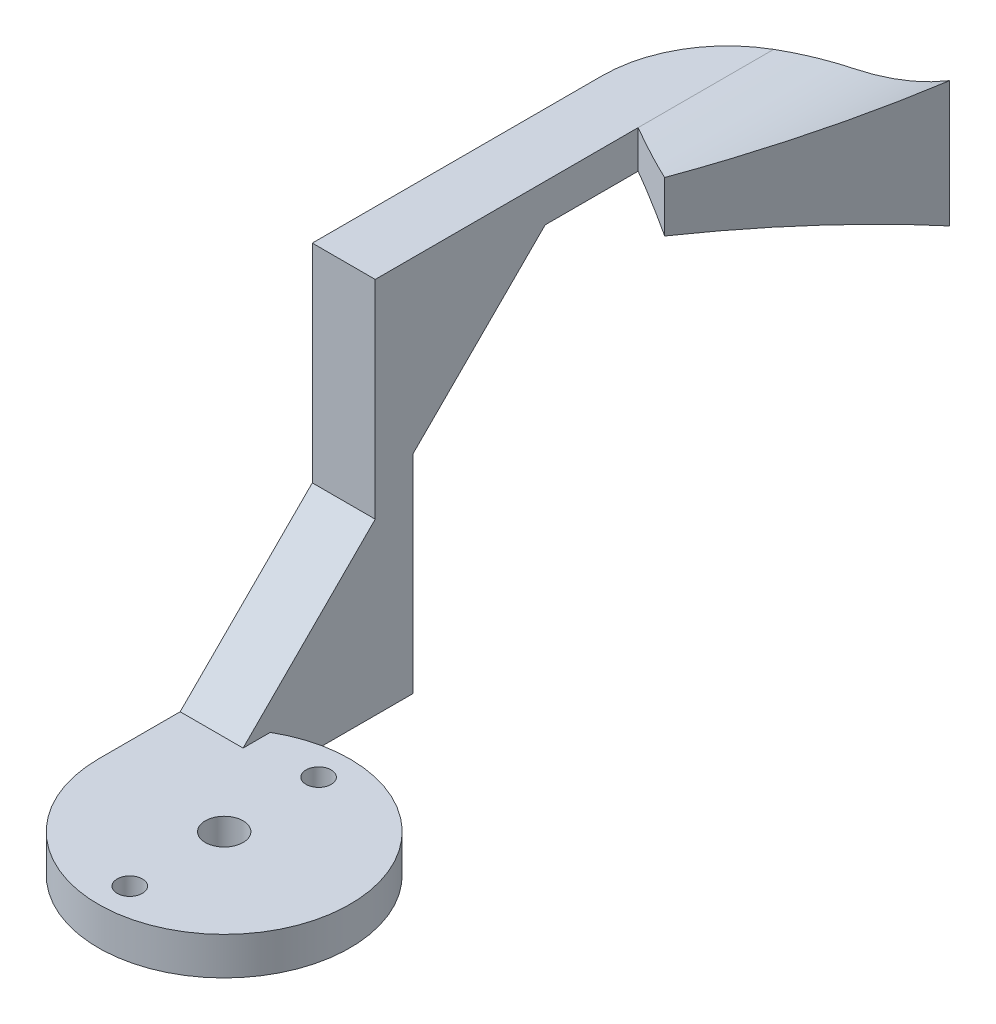
ISO-10303-21;
HEADER;
FILE_DESCRIPTION(('STEP AP214'),'2;1');
FILE_NAME('part.step','',(''),(''),'','','');
FILE_SCHEMA(('AUTOMOTIVE_DESIGN { 1 0 10303 214 1 1 1 1 }'));
ENDSEC;
DATA;
#1=APPLICATION_CONTEXT('core data for automotive mechanical design processes');
#2=APPLICATION_PROTOCOL_DEFINITION('international standard','automotive_design',2000,#1);
#3=PRODUCT_CONTEXT('',#1,'mechanical');
#4=PRODUCT('Part','Part','',(#3));
#5=PRODUCT_RELATED_PRODUCT_CATEGORY('part','',(#4));
#6=PRODUCT_DEFINITION_FORMATION('','',#4);
#7=PRODUCT_DEFINITION_CONTEXT('part definition',#1,'design');
#8=PRODUCT_DEFINITION('design','',#6,#7);
#9=PRODUCT_DEFINITION_SHAPE('','',#8);
#10=(LENGTH_UNIT() NAMED_UNIT(*) SI_UNIT(.MILLI.,.METRE.));
#11=(NAMED_UNIT(*) PLANE_ANGLE_UNIT() SI_UNIT($,.RADIAN.));
#12=(NAMED_UNIT(*) SI_UNIT($,.STERADIAN.) SOLID_ANGLE_UNIT());
#13=UNCERTAINTY_MEASURE_WITH_UNIT(LENGTH_MEASURE(1.E-05),#10,'distance_accuracy_value','');
#14=(GEOMETRIC_REPRESENTATION_CONTEXT(3) GLOBAL_UNCERTAINTY_ASSIGNED_CONTEXT((#13)) GLOBAL_UNIT_ASSIGNED_CONTEXT((#10,
#11,#12)) REPRESENTATION_CONTEXT('',''));
#15=CARTESIAN_POINT('',(0.,0.,0.));
#16=DIRECTION('',(0.,0.,1.));
#17=DIRECTION('',(1.,0.,0.));
#18=AXIS2_PLACEMENT_3D('',#15,#16,#17);
#19=CARTESIAN_POINT('',(-10.,3.,0.));
#20=DIRECTION('',(1.,0.,0.));
#21=DIRECTION('',(0.,0.,-1.));
#22=AXIS2_PLACEMENT_3D('',#19,#20,#21);
#23=PLANE('',#22);
#24=DIRECTION('',(0.,0.,-1.));
#25=VECTOR('',#24,1.);
#26=CARTESIAN_POINT('',(-10.,30.,0.));
#27=LINE('',#26,#25);
#28=CARTESIAN_POINT('',(-10.,30.,-17.));
#29=VERTEX_POINT('',#28);
#30=CARTESIAN_POINT('',(-10.,30.,-40.));
#31=VERTEX_POINT('',#30);
#32=EDGE_CURVE('E247',#29,#31,#27,.T.);
#33=ORIENTED_EDGE('',*,*,#32,.T.);
#34=DIRECTION('',(0.,1.,0.));
#35=VECTOR('',#34,1.);
#36=CARTESIAN_POINT('',(-10.,-7.48187929913333,-40.));
#37=LINE('',#36,#35);
#38=CARTESIAN_POINT('',(-10.,27.,-40.));
#39=VERTEX_POINT('',#38);
#40=EDGE_CURVE('E226',#39,#31,#37,.T.);
#41=ORIENTED_EDGE('',*,*,#40,.F.);
#42=DIRECTION('',(0.,0.,1.));
#43=VECTOR('',#42,1.);
#44=CARTESIAN_POINT('',(-10.,27.,-17.));
#45=LINE('',#44,#43);
#46=CARTESIAN_POINT('',(-10.,27.,-30.5000000000003));
#47=VERTEX_POINT('',#46);
#48=EDGE_CURVE('E223',#39,#47,#45,.T.);
#49=ORIENTED_EDGE('',*,*,#48,.T.);
#50=DIRECTION('',(0.,-0.707106781186539,0.707106781186556));
#51=VECTOR('',#50,1.);
#52=CARTESIAN_POINT('',(-10.,-1.74999999999981,-1.74999999999977));
#53=LINE('',#52,#51);
#54=CARTESIAN_POINT('',(-10.,16.5,-20.));
#55=VERTEX_POINT('',#54);
#56=EDGE_CURVE('E237',#47,#55,#53,.T.);
#57=ORIENTED_EDGE('',*,*,#56,.T.);
#58=DIRECTION('',(0.,-1.,0.));
#59=VECTOR('',#58,1.);
#60=CARTESIAN_POINT('',(-10.,3.,-20.));
#61=LINE('',#60,#59);
#62=CARTESIAN_POINT('',(-10.,0.,-20.));
#63=VERTEX_POINT('',#62);
#64=EDGE_CURVE('E83',#55,#63,#61,.T.);
#65=ORIENTED_EDGE('',*,*,#64,.T.);
#66=DIRECTION('',(0.,0.,1.));
#67=VECTOR('',#66,1.);
#68=CARTESIAN_POINT('',(-10.,0.,0.));
#69=LINE('',#68,#67);
#70=CARTESIAN_POINT('',(-10.,0.,0.));
#71=VERTEX_POINT('',#70);
#72=EDGE_CURVE('E76',#63,#71,#69,.T.);
#73=ORIENTED_EDGE('',*,*,#72,.T.);
#74=DIRECTION('',(0.,-1.,0.));
#75=VECTOR('',#74,1.);
#76=CARTESIAN_POINT('',(-10.,3.,0.));
#77=LINE('',#76,#75);
#78=CARTESIAN_POINT('',(-10.,3.,0.));
#79=VERTEX_POINT('',#78);
#80=EDGE_CURVE('E79',#79,#71,#77,.T.);
#81=ORIENTED_EDGE('',*,*,#80,.F.);
#82=DIRECTION('',(0.,0.,1.));
#83=VECTOR('',#82,1.);
#84=CARTESIAN_POINT('',(-10.,3.,0.));
#85=LINE('',#84,#83);
#86=CARTESIAN_POINT('',(-10.,3.,-6.4999999999997));
#87=VERTEX_POINT('',#86);
#88=EDGE_CURVE('E57',#87,#79,#85,.T.);
#89=ORIENTED_EDGE('',*,*,#88,.F.);
#90=DIRECTION('',(0.,-0.707106781186539,0.707106781186556));
#91=VECTOR('',#90,1.);
#92=CARTESIAN_POINT('',(-10.,-1.74999999999981,-1.74999999999977));
#93=LINE('',#92,#91);
#94=CARTESIAN_POINT('',(-10.,13.5,-17.));
#95=VERTEX_POINT('',#94);
#96=EDGE_CURVE('E225',#95,#87,#93,.T.);
#97=ORIENTED_EDGE('',*,*,#96,.F.);
#98=DIRECTION('',(0.,1.,0.));
#99=VECTOR('',#98,1.);
#100=CARTESIAN_POINT('',(-10.,0.,-17.));
#101=LINE('',#100,#99);
#102=EDGE_CURVE('E245',#95,#29,#101,.T.);
#103=ORIENTED_EDGE('',*,*,#102,.T.);
#104=EDGE_LOOP('',(#33,#41,#49,#57,#65,#73,#81,#89,#97,#103));
#105=FACE_BOUND('',#104,.T.);
#106=ADVANCED_FACE('F36',(#105),#23,.F.);
#107=CARTESIAN_POINT('',(0.,-7.48187929913333,-40.));
#108=DIRECTION('',(0.,1.,0.));
#109=DIRECTION('',(0.,0.,1.));
#110=AXIS2_PLACEMENT_3D('',#107,#108,#109);
#111=CYLINDRICAL_SURFACE('',#110,9.99999999999999);
#112=ORIENTED_EDGE('',*,*,#40,.T.);
#113=CARTESIAN_POINT('',(0.,30.,-40.));
#114=DIRECTION('',(0.,1.,0.));
#115=DIRECTION('',(0.,0.,1.));
#116=AXIS2_PLACEMENT_3D('',#113,#114,#115);
#117=CIRCLE('',#116,9.99999999999999);
#118=CARTESIAN_POINT('',(-5.,30.,-48.6602540378444));
#119=VERTEX_POINT('',#118);
#120=EDGE_CURVE('E214',#31,#119,#117,.F.);
#121=ORIENTED_EDGE('',*,*,#120,.T.);
#122=CARTESIAN_POINT('',(-5.00000000000001,30.,-48.6602540378444));
#123=CARTESIAN_POINT('',(-4.76780427374726,29.9999714006775,-48.794355888389));
#124=CARTESIAN_POINT('',(-4.53016700286463,30.0032883352668,-48.9190604891211));
#125=CARTESIAN_POINT('',(-4.04576558179695,30.0173383024292,-49.1489604372385));
#126=CARTESIAN_POINT('',(-3.79899883583263,30.0280734598002,-49.254150184041));
#127=CARTESIAN_POINT('',(-3.30402666138643,30.0573429613309,-49.4420276477239));
#128=CARTESIAN_POINT('',(-3.05598680798396,30.075690987092,-49.5251799428243));
#129=CARTESIAN_POINT('',(-2.55497067220456,30.120592381275,-49.6716207318108));
#130=CARTESIAN_POINT('',(-2.30199620764166,30.1471427796532,-49.7349163990032));
#131=CARTESIAN_POINT('',(-1.71146035006233,30.2185925493862,-49.8584240534306));
#132=CARTESIAN_POINT('',(-1.37267522194911,30.2666437505436,-49.9112019486332));
#133=CARTESIAN_POINT('',(-0.86114244887352,30.3502638489005,-49.9643626537235));
#134=CARTESIAN_POINT('',(-0.688716605837889,30.3803416252546,-49.9777482297035));
#135=CARTESIAN_POINT('',(-0.344078285002525,30.4442662976743,-49.9955673365444));
#136=CARTESIAN_POINT('',(-0.171865836093102,30.4781136574417,-49.9999997647795));
#137=CARTESIAN_POINT('',(0.,30.5138169810337,-50.));
#138=B_SPLINE_CURVE_WITH_KNOTS('',3,(#122,#123,#124,#125,#126,#127,#128,#129,#130,#131,#132,
#133,#134,#135,#136,#137),.UNSPECIFIED.,.F.,.F.,(4,2,2,2,2,2,2,4),(0.,0.804195556242593,
1.60862155334646,2.39442372995741,3.17994170382442,4.2162091508575,4.74260477274714,
5.26906521899087),.UNSPECIFIED.);
#139=CARTESIAN_POINT('',(0.,30.5138169810337,-50.));
#140=VERTEX_POINT('',#139);
#141=EDGE_CURVE('E281',#119,#140,#138,.T.);
#142=ORIENTED_EDGE('',*,*,#141,.T.);
#143=DIRECTION('',(0.,1.,0.));
#144=VECTOR('',#143,1.);
#145=CARTESIAN_POINT('',(0.,-7.48187929913333,-50.));
#146=LINE('',#145,#144);
#147=CARTESIAN_POINT('',(0.,26.4861830189663,-50.));
#148=VERTEX_POINT('',#147);
#149=EDGE_CURVE('E229',#148,#140,#146,.T.);
#150=ORIENTED_EDGE('',*,*,#149,.F.);
#151=CARTESIAN_POINT('',(0.,26.4861830189663,-50.));
#152=CARTESIAN_POINT('',(-0.262517746514177,26.5407557705343,-50.0000415045389));
#153=CARTESIAN_POINT('',(-0.525969076046815,26.5909590292765,-49.9896640405455));
#154=CARTESIAN_POINT('',(-1.05281929866364,26.6825239117529,-49.9479242579216));
#155=CARTESIAN_POINT('',(-1.31621815667785,26.7238830677488,-49.9165560923865));
#156=CARTESIAN_POINT('',(-1.83482498523233,26.7967733666416,-49.8336581317333));
#157=CARTESIAN_POINT('',(-2.09008145645234,26.828509777686,-49.7826116569452));
#158=CARTESIAN_POINT('',(-2.59661387865083,26.8835654184981,-49.6605076110851));
#159=CARTESIAN_POINT('',(-2.84789122021869,26.9068876537427,-49.589457201437));
#160=CARTESIAN_POINT('',(-3.2601009370102,26.9389065580437,-49.4552349147342));
#161=CARTESIAN_POINT('',(-3.42268848799357,26.9498796471891,-49.3976050194521));
#162=CARTESIAN_POINT('',(-3.74485929821452,26.9684692340454,-49.2739310376327));
#163=CARTESIAN_POINT('',(-3.90444220347491,26.9760853386094,-49.2078859667352));
#164=CARTESIAN_POINT('',(-4.22253489501878,26.988226899739,-49.0664744965941));
#165=CARTESIAN_POINT('',(-4.38098897206747,26.9927022159217,-48.99097859854));
#166=CARTESIAN_POINT('',(-4.6937345730493,26.9985910016761,-48.8317426463199));
#167=CARTESIAN_POINT('',(-4.84802658554491,27.0000048321772,-48.7480035651893));
#168=CARTESIAN_POINT('',(-5.00000000000001,27.,-48.6602540378444));
#169=B_SPLINE_CURVE_WITH_KNOTS('',3,(#151,#152,#153,#154,#155,#156,#157,#158,#159,#160,#161,
#162,#163,#164,#165,#166,#167,#168),.UNSPECIFIED.,.F.,.F.,(4,2,2,2,2,2,2,2,4),(0.,
0.804192014353111,1.60860812757328,2.3944106535297,3.1799322185136,3.69823554748103,
4.21659956042801,4.74306139262274,5.26946115496264),.UNSPECIFIED.);
#170=CARTESIAN_POINT('',(-5.,27.,-48.6602540378444));
#171=VERTEX_POINT('',#170);
#172=EDGE_CURVE('E192',#148,#171,#169,.T.);
#173=ORIENTED_EDGE('',*,*,#172,.T.);
#174=CARTESIAN_POINT('',(0.,27.,-40.));
#175=DIRECTION('',(0.,-1.,0.));
#176=DIRECTION('',(0.,0.,-1.));
#177=AXIS2_PLACEMENT_3D('',#174,#175,#176);
#178=CIRCLE('',#177,9.99999999999999);
#179=EDGE_CURVE('E219',#171,#39,#178,.F.);
#180=ORIENTED_EDGE('',*,*,#179,.T.);
#181=EDGE_LOOP('',(#112,#121,#142,#150,#173,#180));
#182=FACE_BOUND('',#181,.T.);
#183=ADVANCED_FACE('F277',(#182),#111,.T.);
#184=CARTESIAN_POINT('',(-5.,30.,0.));
#185=DIRECTION('',(0.,1.,0.));
#186=DIRECTION('',(0.,0.,1.));
#187=AXIS2_PLACEMENT_3D('',#184,#185,#186);
#188=PLANE('',#187);
#189=DIRECTION('',(0.,0.,-1.));
#190=VECTOR('',#189,1.);
#191=CARTESIAN_POINT('',(-5.,30.,0.));
#192=LINE('',#191,#190);
#193=CARTESIAN_POINT('',(-5.,30.,-17.));
#194=VERTEX_POINT('',#193);
#195=CARTESIAN_POINT('',(-5.,30.,-37.8867513459482));
#196=VERTEX_POINT('',#195);
#197=EDGE_CURVE('E239',#194,#196,#192,.T.);
#198=ORIENTED_EDGE('',*,*,#197,.T.);
#199=DIRECTION('',(0.,0.,1.));
#200=VECTOR('',#199,1.);
#201=CARTESIAN_POINT('',(-5.,30.,-50.));
#202=LINE('',#201,#200);
#203=EDGE_CURVE('E209',#119,#196,#202,.T.);
#204=ORIENTED_EDGE('',*,*,#203,.F.);
#205=ORIENTED_EDGE('',*,*,#120,.F.);
#206=ORIENTED_EDGE('',*,*,#32,.F.);
#207=DIRECTION('',(-1.,0.,0.));
#208=VECTOR('',#207,1.);
#209=CARTESIAN_POINT('',(-5.,30.,-17.));
#210=LINE('',#209,#208);
#211=EDGE_CURVE('E254',#194,#29,#210,.T.);
#212=ORIENTED_EDGE('',*,*,#211,.F.);
#213=EDGE_LOOP('',(#198,#204,#205,#206,#212));
#214=FACE_BOUND('',#213,.T.);
#215=ADVANCED_FACE('F272',(#214),#188,.T.);
#216=CARTESIAN_POINT('',(-5.,27.,0.));
#217=DIRECTION('',(0.,-1.,0.));
#218=DIRECTION('',(0.,0.,-1.));
#219=AXIS2_PLACEMENT_3D('',#216,#217,#218);
#220=PLANE('',#219);
#221=DIRECTION('',(-1.,0.,0.));
#222=VECTOR('',#221,1.);
#223=CARTESIAN_POINT('',(-5.,27.,-30.5000000000003));
#224=LINE('',#223,#222);
#225=CARTESIAN_POINT('',(-5.,27.,-30.5000000000003));
#226=VERTEX_POINT('',#225);
#227=EDGE_CURVE('E251',#226,#47,#224,.T.);
#228=ORIENTED_EDGE('',*,*,#227,.T.);
#229=ORIENTED_EDGE('',*,*,#48,.F.);
#230=ORIENTED_EDGE('',*,*,#179,.F.);
#231=DIRECTION('',(0.,0.,1.));
#232=VECTOR('',#231,1.);
#233=CARTESIAN_POINT('',(-5.,27.,-50.));
#234=LINE('',#233,#232);
#235=CARTESIAN_POINT('',(-5.,27.,-37.8867513459482));
#236=VERTEX_POINT('',#235);
#237=EDGE_CURVE('E319',#171,#236,#234,.T.);
#238=ORIENTED_EDGE('',*,*,#237,.T.);
#239=DIRECTION('',(0.,0.,-1.));
#240=VECTOR('',#239,1.);
#241=CARTESIAN_POINT('',(-5.,27.,-37.8867513459482));
#242=LINE('',#241,#240);
#243=EDGE_CURVE('E213',#226,#236,#242,.T.);
#244=ORIENTED_EDGE('',*,*,#243,.F.);
#245=EDGE_LOOP('',(#228,#229,#230,#238,#244));
#246=FACE_BOUND('',#245,.T.);
#247=ADVANCED_FACE('F320',(#246),#220,.T.);
#248=CARTESIAN_POINT('',(0.,3.,0.));
#249=DIRECTION('',(0.,1.,0.));
#250=DIRECTION('',(0.,0.,1.));
#251=AXIS2_PLACEMENT_3D('',#248,#249,#250);
#252=PLANE('',#251);
#253=CARTESIAN_POINT('',(0.,3.,-7.5));
#254=DIRECTION('',(0.,1.,0.));
#255=DIRECTION('',(0.,0.,1.));
#256=AXIS2_PLACEMENT_3D('',#253,#254,#255);
#257=CIRCLE('',#256,1.);
#258=CARTESIAN_POINT('',(0.,3.,-6.5));
#259=VERTEX_POINT('',#258);
#260=EDGE_CURVE('E198',#259,#259,#257,.T.);
#261=ORIENTED_EDGE('',*,*,#260,.F.);
#262=EDGE_LOOP('',(#261));
#263=FACE_BOUND('',#262,.T.);
#264=CARTESIAN_POINT('',(0.,3.,7.5));
#265=DIRECTION('',(0.,1.,0.));
#266=DIRECTION('',(0.,0.,1.));
#267=AXIS2_PLACEMENT_3D('',#264,#265,#266);
#268=CIRCLE('',#267,1.);
#269=CARTESIAN_POINT('',(0.,3.,8.5));
#270=VERTEX_POINT('',#269);
#271=EDGE_CURVE('E327',#270,#270,#268,.T.);
#272=ORIENTED_EDGE('',*,*,#271,.F.);
#273=EDGE_LOOP('',(#272));
#274=FACE_BOUND('',#273,.T.);
#275=CARTESIAN_POINT('',(0.,3.,0.));
#276=DIRECTION('',(0.,1.,0.));
#277=DIRECTION('',(0.,0.,1.));
#278=AXIS2_PLACEMENT_3D('',#275,#276,#277);
#279=CIRCLE('',#278,1.5);
#280=CARTESIAN_POINT('',(0.,3.,1.5));
#281=VERTEX_POINT('',#280);
#282=EDGE_CURVE('E98',#281,#281,#279,.T.);
#283=ORIENTED_EDGE('',*,*,#282,.F.);
#284=EDGE_LOOP('',(#283));
#285=FACE_BOUND('',#284,.T.);
#286=DIRECTION('',(0.,0.,1.));
#287=VECTOR('',#286,1.);
#288=CARTESIAN_POINT('',(-5.,3.,0.));
#289=LINE('',#288,#287);
#290=CARTESIAN_POINT('',(-5.,3.,-8.66025403784439));
#291=VERTEX_POINT('',#290);
#292=CARTESIAN_POINT('',(-5.,3.,-6.4999999999997));
#293=VERTEX_POINT('',#292);
#294=EDGE_CURVE('E51',#291,#293,#289,.T.);
#295=ORIENTED_EDGE('',*,*,#294,.T.);
#296=DIRECTION('',(-1.,0.,0.));
#297=VECTOR('',#296,1.);
#298=CARTESIAN_POINT('',(-5.,3.,-6.4999999999997));
#299=LINE('',#298,#297);
#300=EDGE_CURVE('E242',#293,#87,#299,.T.);
#301=ORIENTED_EDGE('',*,*,#300,.T.);
#302=ORIENTED_EDGE('',*,*,#88,.T.);
#303=CARTESIAN_POINT('',(0.,3.,0.));
#304=DIRECTION('',(0.,1.,0.));
#305=DIRECTION('',(0.,0.,1.));
#306=AXIS2_PLACEMENT_3D('',#303,#304,#305);
#307=CIRCLE('',#306,10.);
#308=EDGE_CURVE('E87',#79,#291,#307,.T.);
#309=ORIENTED_EDGE('',*,*,#308,.T.);
#310=EDGE_LOOP('',(#295,#301,#302,#309));
#311=FACE_BOUND('',#310,.T.);
#312=ADVANCED_FACE('F261',(#263,#274,#285,#311),#252,.T.);
#313=CARTESIAN_POINT('',(0.,0.,0.));
#314=DIRECTION('',(0.,1.,0.));
#315=DIRECTION('',(0.,0.,1.));
#316=AXIS2_PLACEMENT_3D('',#313,#314,#315);
#317=PLANE('',#316);
#318=CARTESIAN_POINT('',(0.,0.,-7.5));
#319=DIRECTION('',(0.,-1.,0.));
#320=DIRECTION('',(0.,0.,-1.));
#321=AXIS2_PLACEMENT_3D('',#318,#319,#320);
#322=CIRCLE('',#321,1.);
#323=CARTESIAN_POINT('',(0.,0.,-8.5));
#324=VERTEX_POINT('',#323);
#325=EDGE_CURVE('E330',#324,#324,#322,.T.);
#326=ORIENTED_EDGE('',*,*,#325,.F.);
#327=EDGE_LOOP('',(#326));
#328=FACE_BOUND('',#327,.T.);
#329=CARTESIAN_POINT('',(0.,0.,7.5));
#330=DIRECTION('',(0.,-1.,0.));
#331=DIRECTION('',(0.,0.,-1.));
#332=AXIS2_PLACEMENT_3D('',#329,#330,#331);
#333=CIRCLE('',#332,1.);
#334=CARTESIAN_POINT('',(0.,0.,6.5));
#335=VERTEX_POINT('',#334);
#336=EDGE_CURVE('E331',#335,#335,#333,.T.);
#337=ORIENTED_EDGE('',*,*,#336,.F.);
#338=EDGE_LOOP('',(#337));
#339=FACE_BOUND('',#338,.T.);
#340=CARTESIAN_POINT('',(0.,0.,0.));
#341=DIRECTION('',(0.,1.,0.));
#342=DIRECTION('',(0.,0.,1.));
#343=AXIS2_PLACEMENT_3D('',#340,#341,#342);
#344=CIRCLE('',#343,10.);
#345=CARTESIAN_POINT('',(-5.,0.,-8.66025403784439));
#346=VERTEX_POINT('',#345);
#347=EDGE_CURVE('E93',#71,#346,#344,.T.);
#348=ORIENTED_EDGE('',*,*,#347,.F.);
#349=ORIENTED_EDGE('',*,*,#72,.F.);
#350=DIRECTION('',(-1.,0.,0.));
#351=VECTOR('',#350,1.);
#352=CARTESIAN_POINT('',(-10.,0.,-20.));
#353=LINE('',#352,#351);
#354=CARTESIAN_POINT('',(-5.,0.,-20.));
#355=VERTEX_POINT('',#354);
#356=EDGE_CURVE('E88',#355,#63,#353,.T.);
#357=ORIENTED_EDGE('',*,*,#356,.F.);
#358=DIRECTION('',(0.,0.,-1.));
#359=VECTOR('',#358,1.);
#360=CARTESIAN_POINT('',(-5.,0.,-20.));
#361=LINE('',#360,#359);
#362=EDGE_CURVE('E97',#346,#355,#361,.T.);
#363=ORIENTED_EDGE('',*,*,#362,.F.);
#364=EDGE_LOOP('',(#348,#349,#357,#363));
#365=FACE_BOUND('',#364,.T.);
#366=CARTESIAN_POINT('',(0.,0.,0.));
#367=DIRECTION('',(0.,1.,0.));
#368=DIRECTION('',(0.,0.,1.));
#369=AXIS2_PLACEMENT_3D('',#366,#367,#368);
#370=CIRCLE('',#369,1.5);
#371=CARTESIAN_POINT('',(0.,0.,1.5));
#372=VERTEX_POINT('',#371);
#373=EDGE_CURVE('E102',#372,#372,#370,.T.);
#374=ORIENTED_EDGE('',*,*,#373,.T.);
#375=EDGE_LOOP('',(#374));
#376=FACE_BOUND('',#375,.T.);
#377=ADVANCED_FACE('F95',(#328,#339,#365,#376),#317,.F.);
#378=CARTESIAN_POINT('',(0.,3.,0.));
#379=DIRECTION('',(0.,-1.,0.));
#380=DIRECTION('',(0.,0.,-1.));
#381=AXIS2_PLACEMENT_3D('',#378,#379,#380);
#382=CYLINDRICAL_SURFACE('',#381,10.);
#383=ORIENTED_EDGE('',*,*,#347,.T.);
#384=DIRECTION('',(0.,-1.,0.));
#385=VECTOR('',#384,1.);
#386=CARTESIAN_POINT('',(-5.,3.,-8.66025403784439));
#387=LINE('',#386,#385);
#388=EDGE_CURVE('E12',#291,#346,#387,.T.);
#389=ORIENTED_EDGE('',*,*,#388,.F.);
#390=ORIENTED_EDGE('',*,*,#308,.F.);
#391=ORIENTED_EDGE('',*,*,#80,.T.);
#392=EDGE_LOOP('',(#383,#389,#390,#391));
#393=FACE_BOUND('',#392,.T.);
#394=ADVANCED_FACE('F38',(#393),#382,.T.);
#395=CARTESIAN_POINT('',(-5.,3.,-20.));
#396=DIRECTION('',(-1.,0.,0.));
#397=DIRECTION('',(0.,0.,1.));
#398=AXIS2_PLACEMENT_3D('',#395,#396,#397);
#399=PLANE('',#398);
#400=ORIENTED_EDGE('',*,*,#197,.F.);
#401=DIRECTION('',(0.,1.,0.));
#402=VECTOR('',#401,1.);
#403=CARTESIAN_POINT('',(-5.,0.,-17.));
#404=LINE('',#403,#402);
#405=CARTESIAN_POINT('',(-5.,13.5,-17.));
#406=VERTEX_POINT('',#405);
#407=EDGE_CURVE('E236',#406,#194,#404,.T.);
#408=ORIENTED_EDGE('',*,*,#407,.F.);
#409=DIRECTION('',(0.,-0.707106781186539,0.707106781186556));
#410=VECTOR('',#409,1.);
#411=CARTESIAN_POINT('',(-5.,-1.74999999999981,-1.74999999999977));
#412=LINE('',#411,#410);
#413=EDGE_CURVE('E234',#406,#293,#412,.T.);
#414=ORIENTED_EDGE('',*,*,#413,.T.);
#415=ORIENTED_EDGE('',*,*,#294,.F.);
#416=ORIENTED_EDGE('',*,*,#388,.T.);
#417=ORIENTED_EDGE('',*,*,#362,.T.);
#418=DIRECTION('',(0.,-1.,0.));
#419=VECTOR('',#418,1.);
#420=CARTESIAN_POINT('',(-5.,3.,-20.));
#421=LINE('',#420,#419);
#422=CARTESIAN_POINT('',(-5.,16.5,-20.));
#423=VERTEX_POINT('',#422);
#424=EDGE_CURVE('E44',#423,#355,#421,.T.);
#425=ORIENTED_EDGE('',*,*,#424,.F.);
#426=DIRECTION('',(0.,-0.707106781186539,0.707106781186556));
#427=VECTOR('',#426,1.);
#428=CARTESIAN_POINT('',(-5.,-1.74999999999981,-1.74999999999977));
#429=LINE('',#428,#427);
#430=EDGE_CURVE('E122',#226,#423,#429,.T.);
#431=ORIENTED_EDGE('',*,*,#430,.F.);
#432=ORIENTED_EDGE('',*,*,#243,.T.);
#433=DIRECTION('',(0.,1.,0.));
#434=VECTOR('',#433,1.);
#435=CARTESIAN_POINT('',(-5.,-7.48187929913333,-37.8867513459482));
#436=LINE('',#435,#434);
#437=EDGE_CURVE('E216',#236,#196,#436,.T.);
#438=ORIENTED_EDGE('',*,*,#437,.T.);
#439=EDGE_LOOP('',(#400,#408,#414,#415,#416,#417,#425,#431,#432,#438));
#440=FACE_BOUND('',#439,.T.);
#441=ADVANCED_FACE('F119',(#440),#399,.F.);
#442=CARTESIAN_POINT('',(-10.,3.,-20.));
#443=DIRECTION('',(0.,0.,1.));
#444=DIRECTION('',(1.,0.,0.));
#445=AXIS2_PLACEMENT_3D('',#442,#443,#444);
#446=PLANE('',#445);
#447=ORIENTED_EDGE('',*,*,#356,.T.);
#448=ORIENTED_EDGE('',*,*,#64,.F.);
#449=DIRECTION('',(-1.,0.,0.));
#450=VECTOR('',#449,1.);
#451=CARTESIAN_POINT('',(-5.,16.5,-20.));
#452=LINE('',#451,#450);
#453=EDGE_CURVE('E114',#423,#55,#452,.T.);
#454=ORIENTED_EDGE('',*,*,#453,.F.);
#455=ORIENTED_EDGE('',*,*,#424,.T.);
#456=EDGE_LOOP('',(#447,#448,#454,#455));
#457=FACE_BOUND('',#456,.T.);
#458=ADVANCED_FACE('F112',(#457),#446,.F.);
#459=CARTESIAN_POINT('',(0.,3.,0.));
#460=DIRECTION('',(0.,-1.,0.));
#461=DIRECTION('',(0.,0.,-1.));
#462=AXIS2_PLACEMENT_3D('',#459,#460,#461);
#463=CYLINDRICAL_SURFACE('',#462,1.5);
#464=ORIENTED_EDGE('',*,*,#282,.T.);
#465=EDGE_LOOP('',(#464));
#466=FACE_BOUND('',#465,.T.);
#467=ORIENTED_EDGE('',*,*,#373,.F.);
#468=EDGE_LOOP('',(#467));
#469=FACE_BOUND('',#468,.T.);
#470=ADVANCED_FACE('F358',(#466,#469),#463,.F.);
#471=CARTESIAN_POINT('',(-5.,-1.74999999999981,-1.74999999999977));
#472=DIRECTION('',(0.,-0.707106781186556,-0.707106781186539));
#473=DIRECTION('',(0.,0.707106781186539,-0.707106781186556));
#474=AXIS2_PLACEMENT_3D('',#471,#472,#473);
#475=PLANE('',#474);
#476=ORIENTED_EDGE('',*,*,#56,.F.);
#477=ORIENTED_EDGE('',*,*,#227,.F.);
#478=ORIENTED_EDGE('',*,*,#430,.T.);
#479=ORIENTED_EDGE('',*,*,#453,.T.);
#480=EDGE_LOOP('',(#476,#477,#478,#479));
#481=FACE_BOUND('',#480,.T.);
#482=ADVANCED_FACE('F410',(#481),#475,.T.);
#483=CARTESIAN_POINT('',(-5.,0.,-17.));
#484=DIRECTION('',(0.,0.,1.));
#485=DIRECTION('',(0.,-1.,0.));
#486=AXIS2_PLACEMENT_3D('',#483,#484,#485);
#487=PLANE('',#486);
#488=ORIENTED_EDGE('',*,*,#407,.T.);
#489=ORIENTED_EDGE('',*,*,#211,.T.);
#490=ORIENTED_EDGE('',*,*,#102,.F.);
#491=DIRECTION('',(-1.,0.,0.));
#492=VECTOR('',#491,1.);
#493=CARTESIAN_POINT('',(-5.,13.5,-17.));
#494=LINE('',#493,#492);
#495=EDGE_CURVE('E141',#406,#95,#494,.T.);
#496=ORIENTED_EDGE('',*,*,#495,.F.);
#497=EDGE_LOOP('',(#488,#489,#490,#496));
#498=FACE_BOUND('',#497,.T.);
#499=ADVANCED_FACE('F267',(#498),#487,.T.);
#500=CARTESIAN_POINT('',(-5.,-1.74999999999981,-1.74999999999977));
#501=DIRECTION('',(0.,-0.707106781186556,-0.707106781186539));
#502=DIRECTION('',(0.,0.707106781186539,-0.707106781186556));
#503=AXIS2_PLACEMENT_3D('',#500,#501,#502);
#504=PLANE('',#503);
#505=ORIENTED_EDGE('',*,*,#96,.T.);
#506=ORIENTED_EDGE('',*,*,#300,.F.);
#507=ORIENTED_EDGE('',*,*,#413,.F.);
#508=ORIENTED_EDGE('',*,*,#495,.T.);
#509=EDGE_LOOP('',(#505,#506,#507,#508));
#510=FACE_BOUND('',#509,.T.);
#511=ADVANCED_FACE('F265',(#510),#504,.F.);
#512=CARTESIAN_POINT('',(0.,-7.48187929913333,-35.));
#513=DIRECTION('',(-0.500000000000004,0.,0.866025403784436));
#514=DIRECTION('',(0.866025403784437,0.,0.500000000000004));
#515=AXIS2_PLACEMENT_3D('',#512,#513,#514);
#516=PLANE('',#515);
#517=DIRECTION('',(0.,1.,0.));
#518=VECTOR('',#517,1.);
#519=CARTESIAN_POINT('',(0.,-7.48187929913333,-35.));
#520=LINE('',#519,#518);
#521=CARTESIAN_POINT('',(0.,26.4861830189663,-35.));
#522=VERTEX_POINT('',#521);
#523=CARTESIAN_POINT('',(0.,30.5138169810337,-35.));
#524=VERTEX_POINT('',#523);
#525=EDGE_CURVE('E207',#522,#524,#520,.T.);
#526=ORIENTED_EDGE('',*,*,#525,.T.);
#527=CARTESIAN_POINT('',(-5.,54.5846369646753,-37.8867513459482));
#528=DIRECTION('',(-0.500000000000004,0.,0.866025403784436));
#529=DIRECTION('',(0.866025403784437,0.,0.500000000000004));
#530=AXIS2_PLACEMENT_3D('',#527,#528,#529);
#531=ELLIPSE('',#530,28.3878935389691,24.5846369646753);
#532=EDGE_CURVE('E282',#524,#196,#531,.F.);
#533=ORIENTED_EDGE('',*,*,#532,.T.);
#534=ORIENTED_EDGE('',*,*,#437,.F.);
#535=CARTESIAN_POINT('',(-4.99999999999999,2.41536303532465,-37.8867513459482));
#536=DIRECTION('',(-0.500000000000004,0.,0.866025403784436));
#537=DIRECTION('',(0.866025403784437,0.,0.500000000000004));
#538=AXIS2_PLACEMENT_3D('',#535,#536,#537);
#539=ELLIPSE('',#538,28.3878935389691,24.5846369646753);
#540=EDGE_CURVE('E208',#236,#522,#539,.F.);
#541=ORIENTED_EDGE('',*,*,#540,.T.);
#542=EDGE_LOOP('',(#526,#533,#534,#541));
#543=FACE_BOUND('',#542,.T.);
#544=ADVANCED_FACE('F316',(#543),#516,.T.);
#545=CARTESIAN_POINT('',(7.64288174241645,33.5,-50.));
#546=DIRECTION('',(-0.891006524188367,0.,-0.453990499739548));
#547=DIRECTION('',(-0.453990499739548,0.,0.891006524188367));
#548=AXIS2_PLACEMENT_3D('',#545,#546,#547);
#549=PLANE('',#548);
#550=CARTESIAN_POINT('',(-5.,54.5846369646753,-25.1869474724743));
#551=DIRECTION('',(-0.891006524188367,0.,-0.453990499739548));
#552=DIRECTION('',(-0.453990499739548,0.,0.891006524188367));
#553=AXIS2_PLACEMENT_3D('',#550,#551,#552);
#554=ELLIPSE('',#553,54.1523159158164,24.5846369646753);
#555=CARTESIAN_POINT('',(7.64288174241645,33.5,-50.));
#556=VERTEX_POINT('',#555);
#557=EDGE_CURVE('E312',#524,#556,#554,.F.);
#558=ORIENTED_EDGE('',*,*,#557,.F.);
#559=ORIENTED_EDGE('',*,*,#525,.F.);
#560=CARTESIAN_POINT('',(-4.99999999999999,2.41536303532465,-25.1869474724743));
#561=DIRECTION('',(-0.891006524188367,0.,-0.453990499739548));
#562=DIRECTION('',(-0.453990499739548,0.,0.891006524188367));
#563=AXIS2_PLACEMENT_3D('',#560,#561,#562);
#564=ELLIPSE('',#563,54.1523159158163,24.5846369646753);
#565=CARTESIAN_POINT('',(7.64288174241645,23.5,-50.));
#566=VERTEX_POINT('',#565);
#567=EDGE_CURVE('E188',#566,#522,#564,.F.);
#568=ORIENTED_EDGE('',*,*,#567,.F.);
#569=DIRECTION('',(0.,-1.,0.));
#570=VECTOR('',#569,1.);
#571=CARTESIAN_POINT('',(7.64288174241645,33.5,-50.));
#572=LINE('',#571,#570);
#573=EDGE_CURVE('E205',#556,#566,#572,.T.);
#574=ORIENTED_EDGE('',*,*,#573,.F.);
#575=EDGE_LOOP('',(#558,#559,#568,#574));
#576=FACE_BOUND('',#575,.T.);
#577=ADVANCED_FACE('F204',(#576),#549,.F.);
#578=CARTESIAN_POINT('',(0.,33.5,-50.));
#579=DIRECTION('',(0.,0.,1.));
#580=DIRECTION('',(1.,0.,0.));
#581=AXIS2_PLACEMENT_3D('',#578,#579,#580);
#582=PLANE('',#581);
#583=CARTESIAN_POINT('',(-5.,54.5846369646753,-50.));
#584=DIRECTION('',(0.,0.,-1.));
#585=DIRECTION('',(1.,0.,0.));
#586=AXIS2_PLACEMENT_3D('',#583,#584,#585);
#587=CIRCLE('',#586,24.5846369646753);
#588=EDGE_CURVE('E197',#556,#140,#587,.T.);
#589=ORIENTED_EDGE('',*,*,#588,.F.);
#590=ORIENTED_EDGE('',*,*,#573,.T.);
#591=CARTESIAN_POINT('',(-4.99999999999999,2.41536303532465,-50.));
#592=DIRECTION('',(0.,0.,-1.));
#593=DIRECTION('',(-1.,0.,0.));
#594=AXIS2_PLACEMENT_3D('',#591,#592,#593);
#595=CIRCLE('',#594,24.5846369646753);
#596=EDGE_CURVE('E184',#148,#566,#595,.T.);
#597=ORIENTED_EDGE('',*,*,#596,.F.);
#598=ORIENTED_EDGE('',*,*,#149,.T.);
#599=EDGE_LOOP('',(#589,#590,#597,#598));
#600=FACE_BOUND('',#599,.T.);
#601=ADVANCED_FACE('F212',(#600),#582,.F.);
#602=CARTESIAN_POINT('',(-4.99999999999999,2.41536303532465,-50.));
#603=DIRECTION('',(0.,0.,1.));
#604=DIRECTION('',(1.,0.,0.));
#605=AXIS2_PLACEMENT_3D('',#602,#603,#604);
#606=CYLINDRICAL_SURFACE('',#605,24.5846369646753);
#607=ORIENTED_EDGE('',*,*,#596,.T.);
#608=ORIENTED_EDGE('',*,*,#567,.T.);
#609=ORIENTED_EDGE('',*,*,#540,.F.);
#610=ORIENTED_EDGE('',*,*,#237,.F.);
#611=ORIENTED_EDGE('',*,*,#172,.F.);
#612=EDGE_LOOP('',(#607,#608,#609,#610,#611));
#613=FACE_BOUND('',#612,.T.);
#614=ADVANCED_FACE('F186',(#613),#606,.F.);
#615=CARTESIAN_POINT('',(-5.,54.5846369646753,-50.));
#616=DIRECTION('',(0.,0.,1.));
#617=DIRECTION('',(1.,0.,0.));
#618=AXIS2_PLACEMENT_3D('',#615,#616,#617);
#619=CYLINDRICAL_SURFACE('',#618,24.5846369646753);
#620=ORIENTED_EDGE('',*,*,#203,.T.);
#621=ORIENTED_EDGE('',*,*,#532,.F.);
#622=ORIENTED_EDGE('',*,*,#557,.T.);
#623=ORIENTED_EDGE('',*,*,#588,.T.);
#624=ORIENTED_EDGE('',*,*,#141,.F.);
#625=EDGE_LOOP('',(#620,#621,#622,#623,#624));
#626=FACE_BOUND('',#625,.T.);
#627=ADVANCED_FACE('F295',(#626),#619,.F.);
#628=CARTESIAN_POINT('',(0.,33.5,7.5));
#629=DIRECTION('',(0.,-1.,0.));
#630=DIRECTION('',(0.,0.,-1.));
#631=AXIS2_PLACEMENT_3D('',#628,#629,#630);
#632=CYLINDRICAL_SURFACE('',#631,1.);
#633=ORIENTED_EDGE('',*,*,#271,.T.);
#634=EDGE_LOOP('',(#633));
#635=FACE_BOUND('',#634,.T.);
#636=ORIENTED_EDGE('',*,*,#336,.T.);
#637=EDGE_LOOP('',(#636));
#638=FACE_BOUND('',#637,.T.);
#639=ADVANCED_FACE('F300',(#635,#638),#632,.F.);
#640=CARTESIAN_POINT('',(0.,33.5,-7.5));
#641=DIRECTION('',(0.,-1.,0.));
#642=DIRECTION('',(0.,0.,-1.));
#643=AXIS2_PLACEMENT_3D('',#640,#641,#642);
#644=CYLINDRICAL_SURFACE('',#643,1.);
#645=ORIENTED_EDGE('',*,*,#260,.T.);
#646=EDGE_LOOP('',(#645));
#647=FACE_BOUND('',#646,.T.);
#648=ORIENTED_EDGE('',*,*,#325,.T.);
#649=EDGE_LOOP('',(#648));
#650=FACE_BOUND('',#649,.T.);
#651=ADVANCED_FACE('F337',(#647,#650),#644,.F.);
#652=CLOSED_SHELL('',(#106,#183,#215,#247,#312,#377,#394,#441,#458,#470,#482,#499,#511,#544,
#577,#601,#614,#627,#639,#651));
#653=MANIFOLD_SOLID_BREP('B2',#652);
#654=ADVANCED_BREP_SHAPE_REPRESENTATION('',(#18,#653),#14);
#655=SHAPE_DEFINITION_REPRESENTATION(#9,#654);
ENDSEC;
END-ISO-10303-21;
